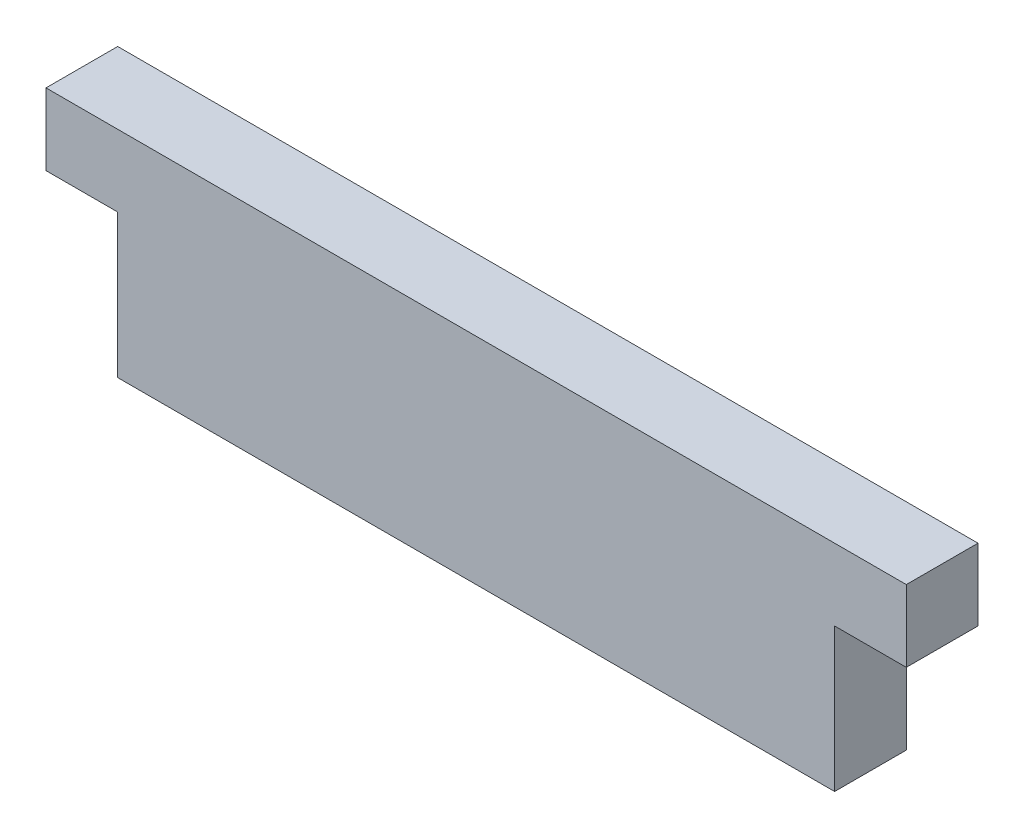
ISO-10303-21;
HEADER;
FILE_DESCRIPTION(('STEP AP214'),'2;1');
FILE_NAME('part.step','',(''),(''),'','','');
FILE_SCHEMA(('AUTOMOTIVE_DESIGN { 1 0 10303 214 1 1 1 1 }'));
ENDSEC;
DATA;
#1=APPLICATION_CONTEXT('core data for automotive mechanical design processes');
#2=APPLICATION_PROTOCOL_DEFINITION('international standard','automotive_design',2000,#1);
#3=PRODUCT_CONTEXT('',#1,'mechanical');
#4=PRODUCT('Part','Part','',(#3));
#5=PRODUCT_RELATED_PRODUCT_CATEGORY('part','',(#4));
#6=PRODUCT_DEFINITION_FORMATION('','',#4);
#7=PRODUCT_DEFINITION_CONTEXT('part definition',#1,'design');
#8=PRODUCT_DEFINITION('design','',#6,#7);
#9=PRODUCT_DEFINITION_SHAPE('','',#8);
#10=(LENGTH_UNIT() NAMED_UNIT(*) SI_UNIT(.MILLI.,.METRE.));
#11=(NAMED_UNIT(*) PLANE_ANGLE_UNIT() SI_UNIT($,.RADIAN.));
#12=(NAMED_UNIT(*) SI_UNIT($,.STERADIAN.) SOLID_ANGLE_UNIT());
#13=UNCERTAINTY_MEASURE_WITH_UNIT(LENGTH_MEASURE(1.E-05),#10,'distance_accuracy_value','');
#14=(GEOMETRIC_REPRESENTATION_CONTEXT(3) GLOBAL_UNCERTAINTY_ASSIGNED_CONTEXT((#13)) GLOBAL_UNIT_ASSIGNED_CONTEXT((#10,
#11,#12)) REPRESENTATION_CONTEXT('',''));
#15=CARTESIAN_POINT('',(0.,0.,0.));
#16=DIRECTION('',(0.,0.,1.));
#17=DIRECTION('',(1.,0.,0.));
#18=AXIS2_PLACEMENT_3D('',#15,#16,#17);
#19=CARTESIAN_POINT('',(0.,0.,5.));
#20=DIRECTION('',(1.,0.,0.));
#21=DIRECTION('',(0.,1.,0.));
#22=AXIS2_PLACEMENT_3D('',#19,#20,#21);
#23=PLANE('',#22);
#24=DIRECTION('',(0.,-1.,0.));
#25=VECTOR('',#24,1.);
#26=CARTESIAN_POINT('',(0.,0.,0.));
#27=LINE('',#26,#25);
#28=CARTESIAN_POINT('',(0.,0.,0.));
#29=VERTEX_POINT('',#28);
#30=CARTESIAN_POINT('',(0.,-10.,0.));
#31=VERTEX_POINT('',#30);
#32=EDGE_CURVE('E130',#29,#31,#27,.T.);
#33=ORIENTED_EDGE('',*,*,#32,.F.);
#34=DIRECTION('',(0.,0.,-1.));
#35=VECTOR('',#34,1.);
#36=CARTESIAN_POINT('',(0.,0.,5.));
#37=LINE('',#36,#35);
#38=CARTESIAN_POINT('',(0.,0.,5.));
#39=VERTEX_POINT('',#38);
#40=EDGE_CURVE('E11',#39,#29,#37,.T.);
#41=ORIENTED_EDGE('',*,*,#40,.F.);
#42=DIRECTION('',(0.,-1.,0.));
#43=VECTOR('',#42,1.);
#44=CARTESIAN_POINT('',(0.,0.,5.));
#45=LINE('',#44,#43);
#46=CARTESIAN_POINT('',(0.,-10.,5.));
#47=VERTEX_POINT('',#46);
#48=EDGE_CURVE('E148',#39,#47,#45,.T.);
#49=ORIENTED_EDGE('',*,*,#48,.T.);
#50=DIRECTION('',(0.,0.,-1.));
#51=VECTOR('',#50,1.);
#52=CARTESIAN_POINT('',(0.,-10.,5.));
#53=LINE('',#52,#51);
#54=EDGE_CURVE('E50',#47,#31,#53,.T.);
#55=ORIENTED_EDGE('',*,*,#54,.T.);
#56=EDGE_LOOP('',(#33,#41,#49,#55));
#57=FACE_BOUND('',#56,.T.);
#58=ADVANCED_FACE('F34',(#57),#23,.T.);
#59=CARTESIAN_POINT('',(0.,0.,5.));
#60=DIRECTION('',(0.,1.,0.));
#61=DIRECTION('',(0.,0.,1.));
#62=AXIS2_PLACEMENT_3D('',#59,#60,#61);
#63=PLANE('',#62);
#64=DIRECTION('',(1.,0.,0.));
#65=VECTOR('',#64,1.);
#66=CARTESIAN_POINT('',(0.,0.,0.));
#67=LINE('',#66,#65);
#68=CARTESIAN_POINT('',(5.,0.,0.));
#69=VERTEX_POINT('',#68);
#70=EDGE_CURVE('E132',#29,#69,#67,.T.);
#71=ORIENTED_EDGE('',*,*,#70,.T.);
#72=DIRECTION('',(0.,0.,-1.));
#73=VECTOR('',#72,1.);
#74=CARTESIAN_POINT('',(5.,0.,5.));
#75=LINE('',#74,#73);
#76=CARTESIAN_POINT('',(5.,0.,5.));
#77=VERTEX_POINT('',#76);
#78=EDGE_CURVE('E42',#77,#69,#75,.T.);
#79=ORIENTED_EDGE('',*,*,#78,.F.);
#80=DIRECTION('',(1.,0.,0.));
#81=VECTOR('',#80,1.);
#82=CARTESIAN_POINT('',(0.,0.,5.));
#83=LINE('',#82,#81);
#84=EDGE_CURVE('E113',#39,#77,#83,.T.);
#85=ORIENTED_EDGE('',*,*,#84,.F.);
#86=ORIENTED_EDGE('',*,*,#40,.T.);
#87=EDGE_LOOP('',(#71,#79,#85,#86));
#88=FACE_BOUND('',#87,.T.);
#89=ADVANCED_FACE('F186',(#88),#63,.F.);
#90=CARTESIAN_POINT('',(5.,0.,5.));
#91=DIRECTION('',(-1.,0.,0.));
#92=DIRECTION('',(0.,0.,1.));
#93=AXIS2_PLACEMENT_3D('',#90,#91,#92);
#94=PLANE('',#93);
#95=DIRECTION('',(0.,1.,0.));
#96=VECTOR('',#95,1.);
#97=CARTESIAN_POINT('',(5.,0.,0.));
#98=LINE('',#97,#96);
#99=CARTESIAN_POINT('',(5.,5.,0.));
#100=VERTEX_POINT('',#99);
#101=EDGE_CURVE('E134',#69,#100,#98,.T.);
#102=ORIENTED_EDGE('',*,*,#101,.T.);
#103=DIRECTION('',(0.,0.,-1.));
#104=VECTOR('',#103,1.);
#105=CARTESIAN_POINT('',(5.,5.,5.));
#106=LINE('',#105,#104);
#107=CARTESIAN_POINT('',(5.,5.,5.));
#108=VERTEX_POINT('',#107);
#109=EDGE_CURVE('E154',#108,#100,#106,.T.);
#110=ORIENTED_EDGE('',*,*,#109,.F.);
#111=DIRECTION('',(0.,1.,0.));
#112=VECTOR('',#111,1.);
#113=CARTESIAN_POINT('',(5.,0.,5.));
#114=LINE('',#113,#112);
#115=EDGE_CURVE('E162',#77,#108,#114,.T.);
#116=ORIENTED_EDGE('',*,*,#115,.F.);
#117=ORIENTED_EDGE('',*,*,#78,.T.);
#118=EDGE_LOOP('',(#102,#110,#116,#117));
#119=FACE_BOUND('',#118,.T.);
#120=ADVANCED_FACE('F160',(#119),#94,.F.);
#121=CARTESIAN_POINT('',(0.,5.,5.));
#122=DIRECTION('',(0.,1.,0.));
#123=DIRECTION('',(0.,0.,1.));
#124=AXIS2_PLACEMENT_3D('',#121,#122,#123);
#125=PLANE('',#124);
#126=DIRECTION('',(1.,0.,0.));
#127=VECTOR('',#126,1.);
#128=CARTESIAN_POINT('',(0.,5.,0.));
#129=LINE('',#128,#127);
#130=CARTESIAN_POINT('',(-55.,5.,0.));
#131=VERTEX_POINT('',#130);
#132=EDGE_CURVE('E137',#131,#100,#129,.T.);
#133=ORIENTED_EDGE('',*,*,#132,.F.);
#134=DIRECTION('',(0.,0.,-1.));
#135=VECTOR('',#134,1.);
#136=CARTESIAN_POINT('',(-55.,5.,5.));
#137=LINE('',#136,#135);
#138=CARTESIAN_POINT('',(-55.,5.,5.));
#139=VERTEX_POINT('',#138);
#140=EDGE_CURVE('E152',#139,#131,#137,.T.);
#141=ORIENTED_EDGE('',*,*,#140,.F.);
#142=DIRECTION('',(1.,0.,0.));
#143=VECTOR('',#142,1.);
#144=CARTESIAN_POINT('',(0.,5.,5.));
#145=LINE('',#144,#143);
#146=EDGE_CURVE('E172',#139,#108,#145,.T.);
#147=ORIENTED_EDGE('',*,*,#146,.T.);
#148=ORIENTED_EDGE('',*,*,#109,.T.);
#149=EDGE_LOOP('',(#133,#141,#147,#148));
#150=FACE_BOUND('',#149,.T.);
#151=ADVANCED_FACE('F170',(#150),#125,.T.);
#152=CARTESIAN_POINT('',(-55.,0.,5.));
#153=DIRECTION('',(-1.,0.,0.));
#154=DIRECTION('',(0.,0.,1.));
#155=AXIS2_PLACEMENT_3D('',#152,#153,#154);
#156=PLANE('',#155);
#157=DIRECTION('',(0.,1.,0.));
#158=VECTOR('',#157,1.);
#159=CARTESIAN_POINT('',(-55.,0.,0.));
#160=LINE('',#159,#158);
#161=CARTESIAN_POINT('',(-55.,0.,0.));
#162=VERTEX_POINT('',#161);
#163=EDGE_CURVE('E140',#162,#131,#160,.T.);
#164=ORIENTED_EDGE('',*,*,#163,.F.);
#165=DIRECTION('',(0.,0.,-1.));
#166=VECTOR('',#165,1.);
#167=CARTESIAN_POINT('',(-55.,0.,5.));
#168=LINE('',#167,#166);
#169=CARTESIAN_POINT('',(-55.,0.,5.));
#170=VERTEX_POINT('',#169);
#171=EDGE_CURVE('E121',#170,#162,#168,.T.);
#172=ORIENTED_EDGE('',*,*,#171,.F.);
#173=DIRECTION('',(0.,1.,0.));
#174=VECTOR('',#173,1.);
#175=CARTESIAN_POINT('',(-55.,0.,5.));
#176=LINE('',#175,#174);
#177=EDGE_CURVE('E110',#170,#139,#176,.T.);
#178=ORIENTED_EDGE('',*,*,#177,.T.);
#179=ORIENTED_EDGE('',*,*,#140,.T.);
#180=EDGE_LOOP('',(#164,#172,#178,#179));
#181=FACE_BOUND('',#180,.T.);
#182=ADVANCED_FACE('F196',(#181),#156,.T.);
#183=CARTESIAN_POINT('',(-50.,0.,0.));
#184=VERTEX_POINT('',#183);
#185=EDGE_CURVE('E118',#162,#184,#67,.T.);
#186=ORIENTED_EDGE('',*,*,#185,.T.);
#187=DIRECTION('',(0.,0.,-1.));
#188=VECTOR('',#187,1.);
#189=CARTESIAN_POINT('',(-50.,0.,5.));
#190=LINE('',#189,#188);
#191=CARTESIAN_POINT('',(-50.,0.,5.));
#192=VERTEX_POINT('',#191);
#193=EDGE_CURVE('E115',#192,#184,#190,.T.);
#194=ORIENTED_EDGE('',*,*,#193,.F.);
#195=EDGE_CURVE('E101',#170,#192,#83,.T.);
#196=ORIENTED_EDGE('',*,*,#195,.F.);
#197=ORIENTED_EDGE('',*,*,#171,.T.);
#198=EDGE_LOOP('',(#186,#194,#196,#197));
#199=FACE_BOUND('',#198,.T.);
#200=ADVANCED_FACE('F116',(#199),#63,.F.);
#201=CARTESIAN_POINT('',(-50.,0.,5.));
#202=DIRECTION('',(1.,0.,0.));
#203=DIRECTION('',(0.,0.,-1.));
#204=AXIS2_PLACEMENT_3D('',#201,#202,#203);
#205=PLANE('',#204);
#206=DIRECTION('',(0.,-1.,0.));
#207=VECTOR('',#206,1.);
#208=CARTESIAN_POINT('',(-50.,0.,0.));
#209=LINE('',#208,#207);
#210=CARTESIAN_POINT('',(-50.,-10.,0.));
#211=VERTEX_POINT('',#210);
#212=EDGE_CURVE('E143',#184,#211,#209,.T.);
#213=ORIENTED_EDGE('',*,*,#212,.T.);
#214=DIRECTION('',(0.,0.,-1.));
#215=VECTOR('',#214,1.);
#216=CARTESIAN_POINT('',(-50.,-10.,5.));
#217=LINE('',#216,#215);
#218=CARTESIAN_POINT('',(-50.,-10.,5.));
#219=VERTEX_POINT('',#218);
#220=EDGE_CURVE('E76',#219,#211,#217,.T.);
#221=ORIENTED_EDGE('',*,*,#220,.F.);
#222=DIRECTION('',(0.,-1.,0.));
#223=VECTOR('',#222,1.);
#224=CARTESIAN_POINT('',(-50.,0.,5.));
#225=LINE('',#224,#223);
#226=EDGE_CURVE('E107',#192,#219,#225,.T.);
#227=ORIENTED_EDGE('',*,*,#226,.F.);
#228=ORIENTED_EDGE('',*,*,#193,.T.);
#229=EDGE_LOOP('',(#213,#221,#227,#228));
#230=FACE_BOUND('',#229,.T.);
#231=ADVANCED_FACE('F123',(#230),#205,.F.);
#232=CARTESIAN_POINT('',(0.,-10.,5.));
#233=DIRECTION('',(0.,-1.,0.));
#234=DIRECTION('',(1.,0.,0.));
#235=AXIS2_PLACEMENT_3D('',#232,#233,#234);
#236=PLANE('',#235);
#237=DIRECTION('',(-1.,0.,0.));
#238=VECTOR('',#237,1.);
#239=CARTESIAN_POINT('',(0.,-10.,0.));
#240=LINE('',#239,#238);
#241=EDGE_CURVE('E145',#31,#211,#240,.T.);
#242=ORIENTED_EDGE('',*,*,#241,.F.);
#243=ORIENTED_EDGE('',*,*,#54,.F.);
#244=DIRECTION('',(-1.,0.,0.));
#245=VECTOR('',#244,1.);
#246=CARTESIAN_POINT('',(0.,-10.,5.));
#247=LINE('',#246,#245);
#248=EDGE_CURVE('E124',#47,#219,#247,.T.);
#249=ORIENTED_EDGE('',*,*,#248,.T.);
#250=ORIENTED_EDGE('',*,*,#220,.T.);
#251=EDGE_LOOP('',(#242,#243,#249,#250));
#252=FACE_BOUND('',#251,.T.);
#253=ADVANCED_FACE('F175',(#252),#236,.T.);
#254=CARTESIAN_POINT('',(0.,0.,5.));
#255=DIRECTION('',(0.,0.,1.));
#256=DIRECTION('',(1.,0.,0.));
#257=AXIS2_PLACEMENT_3D('',#254,#255,#256);
#258=PLANE('',#257);
#259=ORIENTED_EDGE('',*,*,#48,.F.);
#260=ORIENTED_EDGE('',*,*,#84,.T.);
#261=ORIENTED_EDGE('',*,*,#115,.T.);
#262=ORIENTED_EDGE('',*,*,#146,.F.);
#263=ORIENTED_EDGE('',*,*,#177,.F.);
#264=ORIENTED_EDGE('',*,*,#195,.T.);
#265=ORIENTED_EDGE('',*,*,#226,.T.);
#266=ORIENTED_EDGE('',*,*,#248,.F.);
#267=EDGE_LOOP('',(#259,#260,#261,#262,#263,#264,#265,#266));
#268=FACE_BOUND('',#267,.T.);
#269=ADVANCED_FACE('F104',(#268),#258,.T.);
#270=CARTESIAN_POINT('',(0.,0.,0.));
#271=DIRECTION('',(0.,0.,1.));
#272=DIRECTION('',(1.,0.,0.));
#273=AXIS2_PLACEMENT_3D('',#270,#271,#272);
#274=PLANE('',#273);
#275=ORIENTED_EDGE('',*,*,#32,.T.);
#276=ORIENTED_EDGE('',*,*,#241,.T.);
#277=ORIENTED_EDGE('',*,*,#212,.F.);
#278=ORIENTED_EDGE('',*,*,#185,.F.);
#279=ORIENTED_EDGE('',*,*,#163,.T.);
#280=ORIENTED_EDGE('',*,*,#132,.T.);
#281=ORIENTED_EDGE('',*,*,#101,.F.);
#282=ORIENTED_EDGE('',*,*,#70,.F.);
#283=EDGE_LOOP('',(#275,#276,#277,#278,#279,#280,#281,#282));
#284=FACE_BOUND('',#283,.T.);
#285=ADVANCED_FACE('F166',(#284),#274,.F.);
#286=CLOSED_SHELL('',(#58,#89,#120,#151,#182,#200,#231,#253,#269,#285));
#287=MANIFOLD_SOLID_BREP('B2',#286);
#288=ADVANCED_BREP_SHAPE_REPRESENTATION('',(#18,#287),#14);
#289=SHAPE_DEFINITION_REPRESENTATION(#9,#288);
ENDSEC;
END-ISO-10303-21;
